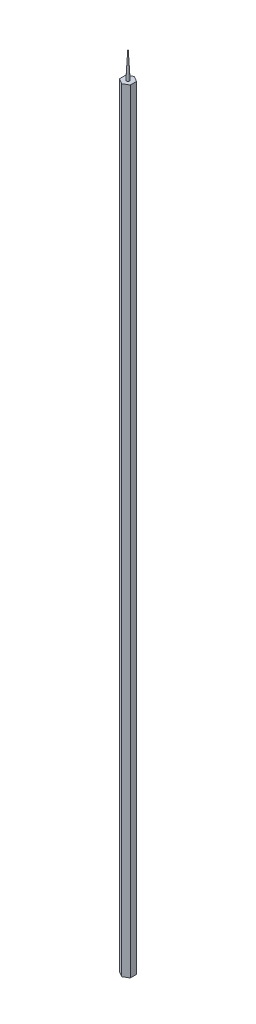
ISO-10303-21;
HEADER;
FILE_DESCRIPTION(('STEP AP214'),'2;1');
FILE_NAME('part.step','',(''),(''),'','','');
FILE_SCHEMA(('AUTOMOTIVE_DESIGN { 1 0 10303 214 1 1 1 1 }'));
ENDSEC;
DATA;
#1=APPLICATION_CONTEXT('core data for automotive mechanical design processes');
#2=APPLICATION_PROTOCOL_DEFINITION('international standard','automotive_design',2000,#1);
#3=PRODUCT_CONTEXT('',#1,'mechanical');
#4=PRODUCT('Part','Part','',(#3));
#5=PRODUCT_RELATED_PRODUCT_CATEGORY('part','',(#4));
#6=PRODUCT_DEFINITION_FORMATION('','',#4);
#7=PRODUCT_DEFINITION_CONTEXT('part definition',#1,'design');
#8=PRODUCT_DEFINITION('design','',#6,#7);
#9=PRODUCT_DEFINITION_SHAPE('','',#8);
#10=(LENGTH_UNIT() NAMED_UNIT(*) SI_UNIT(.MILLI.,.METRE.));
#11=(NAMED_UNIT(*) PLANE_ANGLE_UNIT() SI_UNIT($,.RADIAN.));
#12=(NAMED_UNIT(*) SI_UNIT($,.STERADIAN.) SOLID_ANGLE_UNIT());
#13=UNCERTAINTY_MEASURE_WITH_UNIT(LENGTH_MEASURE(1.E-05),#10,'distance_accuracy_value','');
#14=(GEOMETRIC_REPRESENTATION_CONTEXT(3) GLOBAL_UNCERTAINTY_ASSIGNED_CONTEXT((#13)) GLOBAL_UNIT_ASSIGNED_CONTEXT((#10,
#11,#12)) REPRESENTATION_CONTEXT('',''));
#15=CARTESIAN_POINT('',(0.,0.,0.));
#16=DIRECTION('',(0.,0.,1.));
#17=DIRECTION('',(1.,0.,0.));
#18=AXIS2_PLACEMENT_3D('',#15,#16,#17);
#19=CARTESIAN_POINT('',(0.349999999999998,50.,-0.202072594216373));
#20=DIRECTION('',(-0.499999999999995,0.,0.866025403784441));
#21=DIRECTION('',(0.866025403784442,0.,0.499999999999995));
#22=AXIS2_PLACEMENT_3D('',#19,#20,#21);
#23=PLANE('',#22);
#24=DIRECTION('',(-0.866025403784442,0.,-0.499999999999995));
#25=VECTOR('',#24,1.);
#26=CARTESIAN_POINT('',(0.349999999999998,0.,-0.202072594216373));
#27=LINE('',#26,#25);
#28=CARTESIAN_POINT('',(0.349999999999998,0.,-0.202072594216373));
#29=VERTEX_POINT('',#28);
#30=CARTESIAN_POINT('',(0.,0.,-0.404145188432738));
#31=VERTEX_POINT('',#30);
#32=EDGE_CURVE('E134',#29,#31,#27,.T.);
#33=ORIENTED_EDGE('',*,*,#32,.T.);
#34=DIRECTION('',(0.,-1.,0.));
#35=VECTOR('',#34,1.);
#36=CARTESIAN_POINT('',(0.,50.,-0.404145188432738));
#37=LINE('',#36,#35);
#38=CARTESIAN_POINT('',(0.,50.,-0.404145188432738));
#39=VERTEX_POINT('',#38);
#40=EDGE_CURVE('E11',#39,#31,#37,.T.);
#41=ORIENTED_EDGE('',*,*,#40,.F.);
#42=DIRECTION('',(-0.866025403784442,0.,-0.499999999999995));
#43=VECTOR('',#42,1.);
#44=CARTESIAN_POINT('',(0.349999999999998,50.,-0.202072594216373));
#45=LINE('',#44,#43);
#46=CARTESIAN_POINT('',(0.349999999999998,50.,-0.202072594216373));
#47=VERTEX_POINT('',#46);
#48=EDGE_CURVE('E142',#47,#39,#45,.T.);
#49=ORIENTED_EDGE('',*,*,#48,.F.);
#50=DIRECTION('',(0.,-1.,0.));
#51=VECTOR('',#50,1.);
#52=CARTESIAN_POINT('',(0.349999999999998,50.,-0.202072594216373));
#53=LINE('',#52,#51);
#54=EDGE_CURVE('E128',#47,#29,#53,.T.);
#55=ORIENTED_EDGE('',*,*,#54,.T.);
#56=EDGE_LOOP('',(#33,#41,#49,#55));
#57=FACE_BOUND('',#56,.T.);
#58=ADVANCED_FACE('F50',(#57),#23,.F.);
#59=CARTESIAN_POINT('',(0.,50.,-0.404145188432738));
#60=DIRECTION('',(0.500000000000001,0.,0.866025403784438));
#61=DIRECTION('',(0.866025403784438,0.,-0.500000000000001));
#62=AXIS2_PLACEMENT_3D('',#59,#60,#61);
#63=PLANE('',#62);
#64=DIRECTION('',(-0.866025403784438,0.,0.500000000000001));
#65=VECTOR('',#64,1.);
#66=CARTESIAN_POINT('',(0.,0.,-0.404145188432738));
#67=LINE('',#66,#65);
#68=CARTESIAN_POINT('',(-0.350000000000001,0.,-0.202072594216368));
#69=VERTEX_POINT('',#68);
#70=EDGE_CURVE('E137',#31,#69,#67,.T.);
#71=ORIENTED_EDGE('',*,*,#70,.T.);
#72=DIRECTION('',(0.,-1.,0.));
#73=VECTOR('',#72,1.);
#74=CARTESIAN_POINT('',(-0.350000000000001,50.,-0.202072594216368));
#75=LINE('',#74,#73);
#76=CARTESIAN_POINT('',(-0.350000000000001,50.,-0.202072594216368));
#77=VERTEX_POINT('',#76);
#78=EDGE_CURVE('E54',#77,#69,#75,.T.);
#79=ORIENTED_EDGE('',*,*,#78,.F.);
#80=DIRECTION('',(-0.866025403784438,0.,0.500000000000001));
#81=VECTOR('',#80,1.);
#82=CARTESIAN_POINT('',(0.,50.,-0.404145188432738));
#83=LINE('',#82,#81);
#84=EDGE_CURVE('E103',#39,#77,#83,.T.);
#85=ORIENTED_EDGE('',*,*,#84,.F.);
#86=ORIENTED_EDGE('',*,*,#40,.T.);
#87=EDGE_LOOP('',(#71,#79,#85,#86));
#88=FACE_BOUND('',#87,.T.);
#89=ADVANCED_FACE('F167',(#88),#63,.F.);
#90=CARTESIAN_POINT('',(-0.350000000000001,50.,-0.202072594216368));
#91=DIRECTION('',(1.,0.,0.));
#92=DIRECTION('',(0.,0.,-1.));
#93=AXIS2_PLACEMENT_3D('',#90,#91,#92);
#94=PLANE('',#93);
#95=DIRECTION('',(0.,0.,1.));
#96=VECTOR('',#95,1.);
#97=CARTESIAN_POINT('',(-0.350000000000001,0.,-0.202072594216368));
#98=LINE('',#97,#96);
#99=CARTESIAN_POINT('',(-0.349999999999999,0.,0.202072594216371));
#100=VERTEX_POINT('',#99);
#101=EDGE_CURVE('E136',#69,#100,#98,.T.);
#102=ORIENTED_EDGE('',*,*,#101,.T.);
#103=DIRECTION('',(0.,-1.,0.));
#104=VECTOR('',#103,1.);
#105=CARTESIAN_POINT('',(-0.349999999999999,50.,0.202072594216371));
#106=LINE('',#105,#104);
#107=CARTESIAN_POINT('',(-0.349999999999999,50.,0.202072594216371));
#108=VERTEX_POINT('',#107);
#109=EDGE_CURVE('E122',#108,#100,#106,.T.);
#110=ORIENTED_EDGE('',*,*,#109,.F.);
#111=DIRECTION('',(0.,0.,1.));
#112=VECTOR('',#111,1.);
#113=CARTESIAN_POINT('',(-0.350000000000001,50.,-0.202072594216368));
#114=LINE('',#113,#112);
#115=EDGE_CURVE('E112',#77,#108,#114,.T.);
#116=ORIENTED_EDGE('',*,*,#115,.F.);
#117=ORIENTED_EDGE('',*,*,#78,.T.);
#118=EDGE_LOOP('',(#102,#110,#116,#117));
#119=FACE_BOUND('',#118,.T.);
#120=ADVANCED_FACE('F146',(#119),#94,.F.);
#121=CARTESIAN_POINT('',(-0.349999999999999,50.,0.202072594216371));
#122=DIRECTION('',(0.499999999999995,0.,-0.866025403784442));
#123=DIRECTION('',(-0.866025403784442,0.,-0.499999999999995));
#124=AXIS2_PLACEMENT_3D('',#121,#122,#123);
#125=PLANE('',#124);
#126=DIRECTION('',(0.866025403784442,0.,0.499999999999995));
#127=VECTOR('',#126,1.);
#128=CARTESIAN_POINT('',(-0.349999999999999,0.,0.202072594216371));
#129=LINE('',#128,#127);
#130=CARTESIAN_POINT('',(0.,0.,0.404145188432738));
#131=VERTEX_POINT('',#130);
#132=EDGE_CURVE('E123',#100,#131,#129,.T.);
#133=ORIENTED_EDGE('',*,*,#132,.T.);
#134=DIRECTION('',(0.,-1.,0.));
#135=VECTOR('',#134,1.);
#136=CARTESIAN_POINT('',(0.,50.,0.404145188432738));
#137=LINE('',#136,#135);
#138=CARTESIAN_POINT('',(0.,50.,0.404145188432738));
#139=VERTEX_POINT('',#138);
#140=EDGE_CURVE('E119',#139,#131,#137,.T.);
#141=ORIENTED_EDGE('',*,*,#140,.F.);
#142=DIRECTION('',(0.866025403784442,0.,0.499999999999995));
#143=VECTOR('',#142,1.);
#144=CARTESIAN_POINT('',(-0.349999999999999,50.,0.202072594216371));
#145=LINE('',#144,#143);
#146=EDGE_CURVE('E110',#108,#139,#145,.T.);
#147=ORIENTED_EDGE('',*,*,#146,.F.);
#148=ORIENTED_EDGE('',*,*,#109,.T.);
#149=EDGE_LOOP('',(#133,#141,#147,#148));
#150=FACE_BOUND('',#149,.T.);
#151=ADVANCED_FACE('F121',(#150),#125,.F.);
#152=CARTESIAN_POINT('',(0.,50.,0.404145188432738));
#153=DIRECTION('',(-0.500000000000007,0.,-0.866025403784434));
#154=DIRECTION('',(-0.866025403784435,0.,0.500000000000007));
#155=AXIS2_PLACEMENT_3D('',#152,#153,#154);
#156=PLANE('',#155);
#157=DIRECTION('',(0.866025403784434,0.,-0.500000000000007));
#158=VECTOR('',#157,1.);
#159=CARTESIAN_POINT('',(0.,0.,0.404145188432738));
#160=LINE('',#159,#158);
#161=CARTESIAN_POINT('',(0.350000000000002,0.,0.202072594216366));
#162=VERTEX_POINT('',#161);
#163=EDGE_CURVE('E90',#131,#162,#160,.T.);
#164=ORIENTED_EDGE('',*,*,#163,.T.);
#165=DIRECTION('',(0.,-1.,0.));
#166=VECTOR('',#165,1.);
#167=CARTESIAN_POINT('',(0.350000000000002,50.,0.202072594216366));
#168=LINE('',#167,#166);
#169=CARTESIAN_POINT('',(0.350000000000002,50.,0.202072594216366));
#170=VERTEX_POINT('',#169);
#171=EDGE_CURVE('E124',#170,#162,#168,.T.);
#172=ORIENTED_EDGE('',*,*,#171,.F.);
#173=DIRECTION('',(0.866025403784434,0.,-0.500000000000007));
#174=VECTOR('',#173,1.);
#175=CARTESIAN_POINT('',(0.,50.,0.404145188432738));
#176=LINE('',#175,#174);
#177=EDGE_CURVE('E111',#139,#170,#176,.T.);
#178=ORIENTED_EDGE('',*,*,#177,.F.);
#179=ORIENTED_EDGE('',*,*,#140,.T.);
#180=EDGE_LOOP('',(#164,#172,#178,#179));
#181=FACE_BOUND('',#180,.T.);
#182=ADVANCED_FACE('F130',(#181),#156,.F.);
#183=CARTESIAN_POINT('',(0.350000000000002,50.,0.202072594216366));
#184=DIRECTION('',(-1.,0.,0.));
#185=DIRECTION('',(0.,0.,1.));
#186=AXIS2_PLACEMENT_3D('',#183,#184,#185);
#187=PLANE('',#186);
#188=DIRECTION('',(0.,0.,-1.));
#189=VECTOR('',#188,1.);
#190=CARTESIAN_POINT('',(0.350000000000002,0.,0.202072594216366));
#191=LINE('',#190,#189);
#192=EDGE_CURVE('E91',#162,#29,#191,.T.);
#193=ORIENTED_EDGE('',*,*,#192,.T.);
#194=ORIENTED_EDGE('',*,*,#54,.F.);
#195=DIRECTION('',(0.,0.,-1.));
#196=VECTOR('',#195,1.);
#197=CARTESIAN_POINT('',(0.350000000000002,50.,0.202072594216366));
#198=LINE('',#197,#196);
#199=EDGE_CURVE('E64',#170,#47,#198,.T.);
#200=ORIENTED_EDGE('',*,*,#199,.F.);
#201=ORIENTED_EDGE('',*,*,#171,.T.);
#202=EDGE_LOOP('',(#193,#194,#200,#201));
#203=FACE_BOUND('',#202,.T.);
#204=ADVANCED_FACE('F160',(#203),#187,.F.);
#205=CARTESIAN_POINT('',(0.,50.,0.));
#206=DIRECTION('',(0.,1.,0.));
#207=DIRECTION('',(0.,0.,1.));
#208=AXIS2_PLACEMENT_3D('',#205,#206,#207);
#209=PLANE('',#208);
#210=CARTESIAN_POINT('',(0.,50.,0.));
#211=DIRECTION('',(0.,1.,0.));
#212=DIRECTION('',(0.,0.,1.));
#213=AXIS2_PLACEMENT_3D('',#210,#211,#212);
#214=CIRCLE('',#213,0.1);
#215=CARTESIAN_POINT('',(0.,50.,0.1));
#216=VERTEX_POINT('',#215);
#217=EDGE_CURVE('E140',#216,#216,#214,.T.);
#218=ORIENTED_EDGE('',*,*,#217,.F.);
#219=EDGE_LOOP('',(#218));
#220=FACE_BOUND('',#219,.T.);
#221=ORIENTED_EDGE('',*,*,#48,.T.);
#222=ORIENTED_EDGE('',*,*,#84,.T.);
#223=ORIENTED_EDGE('',*,*,#115,.T.);
#224=ORIENTED_EDGE('',*,*,#146,.T.);
#225=ORIENTED_EDGE('',*,*,#177,.T.);
#226=ORIENTED_EDGE('',*,*,#199,.T.);
#227=EDGE_LOOP('',(#221,#222,#223,#224,#225,#226));
#228=FACE_BOUND('',#227,.T.);
#229=ADVANCED_FACE('F113',(#220,#228),#209,.T.);
#230=CARTESIAN_POINT('',(0.,0.,0.));
#231=DIRECTION('',(0.,1.,0.));
#232=DIRECTION('',(0.,0.,1.));
#233=AXIS2_PLACEMENT_3D('',#230,#231,#232);
#234=PLANE('',#233);
#235=ORIENTED_EDGE('',*,*,#32,.F.);
#236=ORIENTED_EDGE('',*,*,#192,.F.);
#237=ORIENTED_EDGE('',*,*,#163,.F.);
#238=ORIENTED_EDGE('',*,*,#132,.F.);
#239=ORIENTED_EDGE('',*,*,#101,.F.);
#240=ORIENTED_EDGE('',*,*,#70,.F.);
#241=EDGE_LOOP('',(#235,#236,#237,#238,#239,#240));
#242=FACE_BOUND('',#241,.T.);
#243=ADVANCED_FACE('F152',(#242),#234,.F.);
#244=CARTESIAN_POINT('',(0.,50.,0.));
#245=DIRECTION('',(0.,-1.,0.));
#246=DIRECTION('',(0.,0.,1.));
#247=AXIS2_PLACEMENT_3D('',#244,#245,#246);
#248=CONICAL_SURFACE('',#247,0.1,0.0523598775598299);
#249=CARTESIAN_POINT('',(0.,51.9081136687728,0.));
#250=VERTEX_POINT('',#249);
#251=VERTEX_LOOP('',#250);
#252=FACE_BOUND('',#251,.T.);
#253=ORIENTED_EDGE('',*,*,#217,.T.);
#254=EDGE_LOOP('',(#253));
#255=FACE_BOUND('',#254,.T.);
#256=ADVANCED_FACE('F210',(#252,#255),#248,.T.);
#257=CLOSED_SHELL('',(#58,#89,#120,#151,#182,#204,#229,#243,#256));
#258=MANIFOLD_SOLID_BREP('B2',#257);
#259=ADVANCED_BREP_SHAPE_REPRESENTATION('',(#18,#258),#14);
#260=SHAPE_DEFINITION_REPRESENTATION(#9,#259);
ENDSEC;
END-ISO-10303-21;
